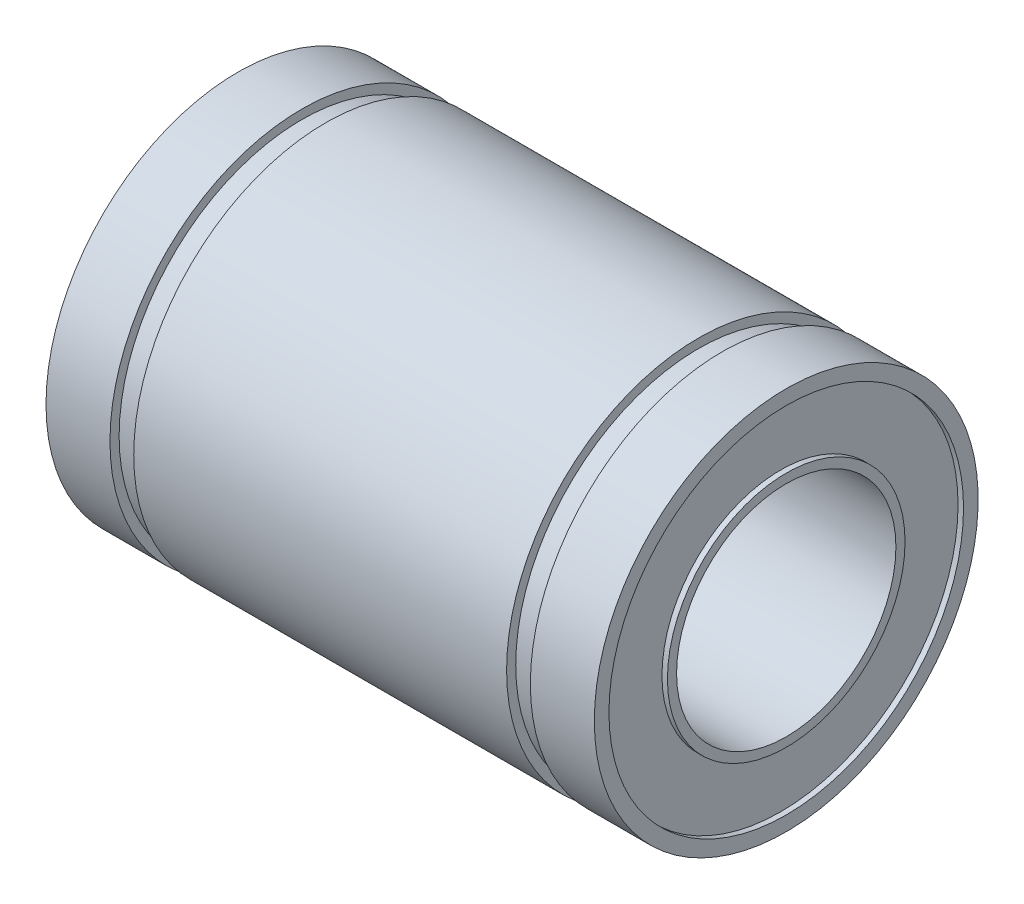
ISO-10303-21;
HEADER;
FILE_DESCRIPTION(('STEP AP214'),'2;1');
FILE_NAME('part.step','',(''),(''),'','','');
FILE_SCHEMA(('AUTOMOTIVE_DESIGN { 1 0 10303 214 1 1 1 1 }'));
ENDSEC;
DATA;
#1=APPLICATION_CONTEXT('core data for automotive mechanical design processes');
#2=APPLICATION_PROTOCOL_DEFINITION('international standard','automotive_design',2000,#1);
#3=PRODUCT_CONTEXT('',#1,'mechanical');
#4=PRODUCT('Part','Part','',(#3));
#5=PRODUCT_RELATED_PRODUCT_CATEGORY('part','',(#4));
#6=PRODUCT_DEFINITION_FORMATION('','',#4);
#7=PRODUCT_DEFINITION_CONTEXT('part definition',#1,'design');
#8=PRODUCT_DEFINITION('design','',#6,#7);
#9=PRODUCT_DEFINITION_SHAPE('','',#8);
#10=(LENGTH_UNIT() NAMED_UNIT(*) SI_UNIT(.MILLI.,.METRE.));
#11=(NAMED_UNIT(*) PLANE_ANGLE_UNIT() SI_UNIT($,.RADIAN.));
#12=(NAMED_UNIT(*) SI_UNIT($,.STERADIAN.) SOLID_ANGLE_UNIT());
#13=UNCERTAINTY_MEASURE_WITH_UNIT(LENGTH_MEASURE(1.E-05),#10,'distance_accuracy_value','');
#14=(GEOMETRIC_REPRESENTATION_CONTEXT(3) GLOBAL_UNCERTAINTY_ASSIGNED_CONTEXT((#13)) GLOBAL_UNIT_ASSIGNED_CONTEXT((#10,
#11,#12)) REPRESENTATION_CONTEXT('',''));
#15=CARTESIAN_POINT('',(0.,0.,0.));
#16=DIRECTION('',(0.,0.,1.));
#17=DIRECTION('',(1.,0.,0.));
#18=AXIS2_PLACEMENT_3D('',#15,#16,#17);
#19=CARTESIAN_POINT('',(-15.,6.,0.));
#20=DIRECTION('',(1.,0.,0.));
#21=DIRECTION('',(0.,0.,-1.));
#22=AXIS2_PLACEMENT_3D('',#19,#20,#21);
#23=PLANE('',#22);
#24=CARTESIAN_POINT('',(-15.,0.,0.));
#25=DIRECTION('',(-1.,0.,0.));
#26=DIRECTION('',(0.,0.,1.));
#27=AXIS2_PLACEMENT_3D('',#24,#25,#26);
#28=CIRCLE('',#27,6.);
#29=CARTESIAN_POINT('',(-15.,0.,6.));
#30=VERTEX_POINT('',#29);
#31=EDGE_CURVE('E97',#30,#30,#28,.T.);
#32=ORIENTED_EDGE('',*,*,#31,.F.);
#33=EDGE_LOOP('',(#32));
#34=FACE_BOUND('',#33,.T.);
#35=CARTESIAN_POINT('',(-15.,0.,0.));
#36=DIRECTION('',(-1.,0.,0.));
#37=DIRECTION('',(0.,0.,1.));
#38=AXIS2_PLACEMENT_3D('',#35,#36,#37);
#39=CIRCLE('',#38,6.5);
#40=CARTESIAN_POINT('',(-15.,0.,6.5));
#41=VERTEX_POINT('',#40);
#42=EDGE_CURVE('E10',#41,#41,#39,.T.);
#43=ORIENTED_EDGE('',*,*,#42,.T.);
#44=EDGE_LOOP('',(#43));
#45=FACE_BOUND('',#44,.T.);
#46=ADVANCED_FACE('F33',(#34,#45),#23,.F.);
#47=CARTESIAN_POINT('',(-15.,0.,0.));
#48=DIRECTION('',(-1.,0.,0.));
#49=DIRECTION('',(0.,0.,1.));
#50=AXIS2_PLACEMENT_3D('',#47,#48,#49);
#51=CYLINDRICAL_SURFACE('',#50,6.5);
#52=ORIENTED_EDGE('',*,*,#42,.F.);
#53=EDGE_LOOP('',(#52));
#54=FACE_BOUND('',#53,.T.);
#55=CARTESIAN_POINT('',(-14.7,0.,0.));
#56=DIRECTION('',(-1.,0.,0.));
#57=DIRECTION('',(0.,0.,1.));
#58=AXIS2_PLACEMENT_3D('',#55,#56,#57);
#59=CIRCLE('',#58,6.5);
#60=CARTESIAN_POINT('',(-14.7,0.,6.5));
#61=VERTEX_POINT('',#60);
#62=EDGE_CURVE('E39',#61,#61,#59,.T.);
#63=ORIENTED_EDGE('',*,*,#62,.T.);
#64=EDGE_LOOP('',(#63));
#65=FACE_BOUND('',#64,.T.);
#66=ADVANCED_FACE('F104',(#54,#65),#51,.T.);
#67=CARTESIAN_POINT('',(-14.7,9.7,0.));
#68=DIRECTION('',(1.,0.,0.));
#69=DIRECTION('',(0.,0.,-1.));
#70=AXIS2_PLACEMENT_3D('',#67,#68,#69);
#71=PLANE('',#70);
#72=ORIENTED_EDGE('',*,*,#62,.F.);
#73=EDGE_LOOP('',(#72));
#74=FACE_BOUND('',#73,.T.);
#75=CARTESIAN_POINT('',(-14.7,0.,0.));
#76=DIRECTION('',(-1.,0.,0.));
#77=DIRECTION('',(0.,0.,1.));
#78=AXIS2_PLACEMENT_3D('',#75,#76,#77);
#79=CIRCLE('',#78,9.7);
#80=CARTESIAN_POINT('',(-14.7,0.,9.7));
#81=VERTEX_POINT('',#80);
#82=EDGE_CURVE('E43',#81,#81,#79,.T.);
#83=ORIENTED_EDGE('',*,*,#82,.T.);
#84=EDGE_LOOP('',(#83));
#85=FACE_BOUND('',#84,.T.);
#86=ADVANCED_FACE('F108',(#74,#85),#71,.F.);
#87=CARTESIAN_POINT('',(-15.,0.,0.));
#88=DIRECTION('',(-1.,0.,0.));
#89=DIRECTION('',(0.,0.,1.));
#90=AXIS2_PLACEMENT_3D('',#87,#88,#89);
#91=CYLINDRICAL_SURFACE('',#90,9.7);
#92=ORIENTED_EDGE('',*,*,#82,.F.);
#93=EDGE_LOOP('',(#92));
#94=FACE_BOUND('',#93,.T.);
#95=CARTESIAN_POINT('',(-15.,0.,0.));
#96=DIRECTION('',(-1.,0.,0.));
#97=DIRECTION('',(0.,0.,1.));
#98=AXIS2_PLACEMENT_3D('',#95,#96,#97);
#99=CIRCLE('',#98,9.7);
#100=CARTESIAN_POINT('',(-15.,0.,9.7));
#101=VERTEX_POINT('',#100);
#102=EDGE_CURVE('E47',#101,#101,#99,.T.);
#103=ORIENTED_EDGE('',*,*,#102,.T.);
#104=EDGE_LOOP('',(#103));
#105=FACE_BOUND('',#104,.T.);
#106=ADVANCED_FACE('F113',(#94,#105),#91,.F.);
#107=CARTESIAN_POINT('',(-15.,9.7,0.));
#108=DIRECTION('',(1.,0.,0.));
#109=DIRECTION('',(0.,0.,-1.));
#110=AXIS2_PLACEMENT_3D('',#107,#108,#109);
#111=PLANE('',#110);
#112=ORIENTED_EDGE('',*,*,#102,.F.);
#113=EDGE_LOOP('',(#112));
#114=FACE_BOUND('',#113,.T.);
#115=CARTESIAN_POINT('',(-15.,0.,0.));
#116=DIRECTION('',(-1.,0.,0.));
#117=DIRECTION('',(0.,0.,1.));
#118=AXIS2_PLACEMENT_3D('',#115,#116,#117);
#119=CIRCLE('',#118,10.5);
#120=CARTESIAN_POINT('',(-15.,0.,10.5));
#121=VERTEX_POINT('',#120);
#122=EDGE_CURVE('E52',#121,#121,#119,.T.);
#123=ORIENTED_EDGE('',*,*,#122,.T.);
#124=EDGE_LOOP('',(#123));
#125=FACE_BOUND('',#124,.T.);
#126=ADVANCED_FACE('F119',(#114,#125),#111,.F.);
#127=CARTESIAN_POINT('',(-15.,0.,0.));
#128=DIRECTION('',(-1.,0.,0.));
#129=DIRECTION('',(0.,0.,1.));
#130=AXIS2_PLACEMENT_3D('',#127,#128,#129);
#131=CYLINDRICAL_SURFACE('',#130,10.5);
#132=ORIENTED_EDGE('',*,*,#122,.F.);
#133=EDGE_LOOP('',(#132));
#134=FACE_BOUND('',#133,.T.);
#135=CARTESIAN_POINT('',(-11.5,0.,0.));
#136=DIRECTION('',(-1.,0.,0.));
#137=DIRECTION('',(0.,0.,1.));
#138=AXIS2_PLACEMENT_3D('',#135,#136,#137);
#139=CIRCLE('',#138,10.5);
#140=CARTESIAN_POINT('',(-11.5,0.,10.5));
#141=VERTEX_POINT('',#140);
#142=EDGE_CURVE('E55',#141,#141,#139,.T.);
#143=ORIENTED_EDGE('',*,*,#142,.T.);
#144=EDGE_LOOP('',(#143));
#145=FACE_BOUND('',#144,.T.);
#146=ADVANCED_FACE('F123',(#134,#145),#131,.T.);
#147=CARTESIAN_POINT('',(-11.5,10.5,0.));
#148=DIRECTION('',(-1.,0.,0.));
#149=DIRECTION('',(0.,0.,1.));
#150=AXIS2_PLACEMENT_3D('',#147,#148,#149);
#151=PLANE('',#150);
#152=ORIENTED_EDGE('',*,*,#142,.F.);
#153=EDGE_LOOP('',(#152));
#154=FACE_BOUND('',#153,.T.);
#155=CARTESIAN_POINT('',(-11.5,0.,0.));
#156=DIRECTION('',(-1.,0.,0.));
#157=DIRECTION('',(0.,0.,1.));
#158=AXIS2_PLACEMENT_3D('',#155,#156,#157);
#159=CIRCLE('',#158,10.);
#160=CARTESIAN_POINT('',(-11.5,0.,10.));
#161=VERTEX_POINT('',#160);
#162=EDGE_CURVE('E58',#161,#161,#159,.T.);
#163=ORIENTED_EDGE('',*,*,#162,.T.);
#164=EDGE_LOOP('',(#163));
#165=FACE_BOUND('',#164,.T.);
#166=ADVANCED_FACE('F127',(#154,#165),#151,.F.);
#167=CARTESIAN_POINT('',(-15.,0.,0.));
#168=DIRECTION('',(-1.,0.,0.));
#169=DIRECTION('',(0.,0.,1.));
#170=AXIS2_PLACEMENT_3D('',#167,#168,#169);
#171=CYLINDRICAL_SURFACE('',#170,10.);
#172=ORIENTED_EDGE('',*,*,#162,.F.);
#173=EDGE_LOOP('',(#172));
#174=FACE_BOUND('',#173,.T.);
#175=CARTESIAN_POINT('',(-10.2,0.,0.));
#176=DIRECTION('',(-1.,0.,0.));
#177=DIRECTION('',(0.,0.,1.));
#178=AXIS2_PLACEMENT_3D('',#175,#176,#177);
#179=CIRCLE('',#178,10.);
#180=CARTESIAN_POINT('',(-10.2,0.,10.));
#181=VERTEX_POINT('',#180);
#182=EDGE_CURVE('E61',#181,#181,#179,.T.);
#183=ORIENTED_EDGE('',*,*,#182,.T.);
#184=EDGE_LOOP('',(#183));
#185=FACE_BOUND('',#184,.T.);
#186=ADVANCED_FACE('F131',(#174,#185),#171,.T.);
#187=CARTESIAN_POINT('',(-10.2,10.5,0.));
#188=DIRECTION('',(1.,0.,0.));
#189=DIRECTION('',(0.,0.,-1.));
#190=AXIS2_PLACEMENT_3D('',#187,#188,#189);
#191=PLANE('',#190);
#192=ORIENTED_EDGE('',*,*,#182,.F.);
#193=EDGE_LOOP('',(#192));
#194=FACE_BOUND('',#193,.T.);
#195=CARTESIAN_POINT('',(-10.2,0.,0.));
#196=DIRECTION('',(-1.,0.,0.));
#197=DIRECTION('',(0.,0.,1.));
#198=AXIS2_PLACEMENT_3D('',#195,#196,#197);
#199=CIRCLE('',#198,10.5);
#200=CARTESIAN_POINT('',(-10.2,0.,10.5));
#201=VERTEX_POINT('',#200);
#202=EDGE_CURVE('E64',#201,#201,#199,.T.);
#203=ORIENTED_EDGE('',*,*,#202,.T.);
#204=EDGE_LOOP('',(#203));
#205=FACE_BOUND('',#204,.T.);
#206=ADVANCED_FACE('F135',(#194,#205),#191,.F.);
#207=CARTESIAN_POINT('',(-15.,0.,0.));
#208=DIRECTION('',(-1.,0.,0.));
#209=DIRECTION('',(0.,0.,1.));
#210=AXIS2_PLACEMENT_3D('',#207,#208,#209);
#211=CYLINDRICAL_SURFACE('',#210,10.5);
#212=ORIENTED_EDGE('',*,*,#202,.F.);
#213=EDGE_LOOP('',(#212));
#214=FACE_BOUND('',#213,.T.);
#215=CARTESIAN_POINT('',(10.2,0.,0.));
#216=DIRECTION('',(-1.,0.,0.));
#217=DIRECTION('',(0.,0.,1.));
#218=AXIS2_PLACEMENT_3D('',#215,#216,#217);
#219=CIRCLE('',#218,10.5);
#220=CARTESIAN_POINT('',(10.2,0.,10.5));
#221=VERTEX_POINT('',#220);
#222=EDGE_CURVE('E67',#221,#221,#219,.T.);
#223=ORIENTED_EDGE('',*,*,#222,.T.);
#224=EDGE_LOOP('',(#223));
#225=FACE_BOUND('',#224,.T.);
#226=ADVANCED_FACE('F139',(#214,#225),#211,.T.);
#227=CARTESIAN_POINT('',(10.2,10.5,0.));
#228=DIRECTION('',(-1.,0.,0.));
#229=DIRECTION('',(0.,0.,1.));
#230=AXIS2_PLACEMENT_3D('',#227,#228,#229);
#231=PLANE('',#230);
#232=ORIENTED_EDGE('',*,*,#222,.F.);
#233=EDGE_LOOP('',(#232));
#234=FACE_BOUND('',#233,.T.);
#235=CARTESIAN_POINT('',(10.2,0.,0.));
#236=DIRECTION('',(-1.,0.,0.));
#237=DIRECTION('',(0.,0.,1.));
#238=AXIS2_PLACEMENT_3D('',#235,#236,#237);
#239=CIRCLE('',#238,10.);
#240=CARTESIAN_POINT('',(10.2,0.,10.));
#241=VERTEX_POINT('',#240);
#242=EDGE_CURVE('E70',#241,#241,#239,.T.);
#243=ORIENTED_EDGE('',*,*,#242,.T.);
#244=EDGE_LOOP('',(#243));
#245=FACE_BOUND('',#244,.T.);
#246=ADVANCED_FACE('F143',(#234,#245),#231,.F.);
#247=CARTESIAN_POINT('',(-15.,0.,0.));
#248=DIRECTION('',(-1.,0.,0.));
#249=DIRECTION('',(0.,0.,1.));
#250=AXIS2_PLACEMENT_3D('',#247,#248,#249);
#251=CYLINDRICAL_SURFACE('',#250,10.);
#252=ORIENTED_EDGE('',*,*,#242,.F.);
#253=EDGE_LOOP('',(#252));
#254=FACE_BOUND('',#253,.T.);
#255=CARTESIAN_POINT('',(11.5,0.,0.));
#256=DIRECTION('',(-1.,0.,0.));
#257=DIRECTION('',(0.,0.,1.));
#258=AXIS2_PLACEMENT_3D('',#255,#256,#257);
#259=CIRCLE('',#258,10.);
#260=CARTESIAN_POINT('',(11.5,0.,10.));
#261=VERTEX_POINT('',#260);
#262=EDGE_CURVE('E73',#261,#261,#259,.T.);
#263=ORIENTED_EDGE('',*,*,#262,.T.);
#264=EDGE_LOOP('',(#263));
#265=FACE_BOUND('',#264,.T.);
#266=ADVANCED_FACE('F147',(#254,#265),#251,.T.);
#267=CARTESIAN_POINT('',(11.5,10.5,0.));
#268=DIRECTION('',(1.,0.,0.));
#269=DIRECTION('',(0.,0.,-1.));
#270=AXIS2_PLACEMENT_3D('',#267,#268,#269);
#271=PLANE('',#270);
#272=ORIENTED_EDGE('',*,*,#262,.F.);
#273=EDGE_LOOP('',(#272));
#274=FACE_BOUND('',#273,.T.);
#275=CARTESIAN_POINT('',(11.5,0.,0.));
#276=DIRECTION('',(-1.,0.,0.));
#277=DIRECTION('',(0.,0.,1.));
#278=AXIS2_PLACEMENT_3D('',#275,#276,#277);
#279=CIRCLE('',#278,10.5);
#280=CARTESIAN_POINT('',(11.5,0.,10.5));
#281=VERTEX_POINT('',#280);
#282=EDGE_CURVE('E76',#281,#281,#279,.T.);
#283=ORIENTED_EDGE('',*,*,#282,.T.);
#284=EDGE_LOOP('',(#283));
#285=FACE_BOUND('',#284,.T.);
#286=ADVANCED_FACE('F151',(#274,#285),#271,.F.);
#287=CARTESIAN_POINT('',(-15.,0.,0.));
#288=DIRECTION('',(-1.,0.,0.));
#289=DIRECTION('',(0.,0.,1.));
#290=AXIS2_PLACEMENT_3D('',#287,#288,#289);
#291=CYLINDRICAL_SURFACE('',#290,10.5);
#292=ORIENTED_EDGE('',*,*,#282,.F.);
#293=EDGE_LOOP('',(#292));
#294=FACE_BOUND('',#293,.T.);
#295=CARTESIAN_POINT('',(15.,0.,0.));
#296=DIRECTION('',(-1.,0.,0.));
#297=DIRECTION('',(0.,0.,1.));
#298=AXIS2_PLACEMENT_3D('',#295,#296,#297);
#299=CIRCLE('',#298,10.5);
#300=CARTESIAN_POINT('',(15.,0.,10.5));
#301=VERTEX_POINT('',#300);
#302=EDGE_CURVE('E79',#301,#301,#299,.T.);
#303=ORIENTED_EDGE('',*,*,#302,.T.);
#304=EDGE_LOOP('',(#303));
#305=FACE_BOUND('',#304,.T.);
#306=ADVANCED_FACE('F155',(#294,#305),#291,.T.);
#307=CARTESIAN_POINT('',(15.,9.7,0.));
#308=DIRECTION('',(-1.,0.,0.));
#309=DIRECTION('',(0.,0.,1.));
#310=AXIS2_PLACEMENT_3D('',#307,#308,#309);
#311=PLANE('',#310);
#312=ORIENTED_EDGE('',*,*,#302,.F.);
#313=EDGE_LOOP('',(#312));
#314=FACE_BOUND('',#313,.T.);
#315=CARTESIAN_POINT('',(15.,0.,0.));
#316=DIRECTION('',(-1.,0.,0.));
#317=DIRECTION('',(0.,0.,1.));
#318=AXIS2_PLACEMENT_3D('',#315,#316,#317);
#319=CIRCLE('',#318,9.7);
#320=CARTESIAN_POINT('',(15.,0.,9.7));
#321=VERTEX_POINT('',#320);
#322=EDGE_CURVE('E82',#321,#321,#319,.T.);
#323=ORIENTED_EDGE('',*,*,#322,.T.);
#324=EDGE_LOOP('',(#323));
#325=FACE_BOUND('',#324,.T.);
#326=ADVANCED_FACE('F159',(#314,#325),#311,.F.);
#327=CARTESIAN_POINT('',(-15.,0.,0.));
#328=DIRECTION('',(-1.,0.,0.));
#329=DIRECTION('',(0.,0.,1.));
#330=AXIS2_PLACEMENT_3D('',#327,#328,#329);
#331=CYLINDRICAL_SURFACE('',#330,9.7);
#332=ORIENTED_EDGE('',*,*,#322,.F.);
#333=EDGE_LOOP('',(#332));
#334=FACE_BOUND('',#333,.T.);
#335=CARTESIAN_POINT('',(14.7,0.,0.));
#336=DIRECTION('',(-1.,0.,0.));
#337=DIRECTION('',(0.,0.,1.));
#338=AXIS2_PLACEMENT_3D('',#335,#336,#337);
#339=CIRCLE('',#338,9.7);
#340=CARTESIAN_POINT('',(14.7,0.,9.7));
#341=VERTEX_POINT('',#340);
#342=EDGE_CURVE('E85',#341,#341,#339,.T.);
#343=ORIENTED_EDGE('',*,*,#342,.T.);
#344=EDGE_LOOP('',(#343));
#345=FACE_BOUND('',#344,.T.);
#346=ADVANCED_FACE('F163',(#334,#345),#331,.F.);
#347=CARTESIAN_POINT('',(14.7,9.7,0.));
#348=DIRECTION('',(-1.,0.,0.));
#349=DIRECTION('',(0.,0.,1.));
#350=AXIS2_PLACEMENT_3D('',#347,#348,#349);
#351=PLANE('',#350);
#352=ORIENTED_EDGE('',*,*,#342,.F.);
#353=EDGE_LOOP('',(#352));
#354=FACE_BOUND('',#353,.T.);
#355=CARTESIAN_POINT('',(14.7,0.,0.));
#356=DIRECTION('',(-1.,0.,0.));
#357=DIRECTION('',(0.,0.,1.));
#358=AXIS2_PLACEMENT_3D('',#355,#356,#357);
#359=CIRCLE('',#358,6.5);
#360=CARTESIAN_POINT('',(14.7,0.,6.5));
#361=VERTEX_POINT('',#360);
#362=EDGE_CURVE('E88',#361,#361,#359,.T.);
#363=ORIENTED_EDGE('',*,*,#362,.T.);
#364=EDGE_LOOP('',(#363));
#365=FACE_BOUND('',#364,.T.);
#366=ADVANCED_FACE('F167',(#354,#365),#351,.F.);
#367=CARTESIAN_POINT('',(-15.,0.,0.));
#368=DIRECTION('',(-1.,0.,0.));
#369=DIRECTION('',(0.,0.,1.));
#370=AXIS2_PLACEMENT_3D('',#367,#368,#369);
#371=CYLINDRICAL_SURFACE('',#370,6.5);
#372=ORIENTED_EDGE('',*,*,#362,.F.);
#373=EDGE_LOOP('',(#372));
#374=FACE_BOUND('',#373,.T.);
#375=CARTESIAN_POINT('',(15.,0.,0.));
#376=DIRECTION('',(-1.,0.,0.));
#377=DIRECTION('',(0.,0.,1.));
#378=AXIS2_PLACEMENT_3D('',#375,#376,#377);
#379=CIRCLE('',#378,6.5);
#380=CARTESIAN_POINT('',(15.,0.,6.5));
#381=VERTEX_POINT('',#380);
#382=EDGE_CURVE('E91',#381,#381,#379,.T.);
#383=ORIENTED_EDGE('',*,*,#382,.T.);
#384=EDGE_LOOP('',(#383));
#385=FACE_BOUND('',#384,.T.);
#386=ADVANCED_FACE('F171',(#374,#385),#371,.T.);
#387=CARTESIAN_POINT('',(15.,6.,0.));
#388=DIRECTION('',(-1.,0.,0.));
#389=DIRECTION('',(0.,0.,1.));
#390=AXIS2_PLACEMENT_3D('',#387,#388,#389);
#391=PLANE('',#390);
#392=ORIENTED_EDGE('',*,*,#382,.F.);
#393=EDGE_LOOP('',(#392));
#394=FACE_BOUND('',#393,.T.);
#395=CARTESIAN_POINT('',(15.,0.,0.));
#396=DIRECTION('',(-1.,0.,0.));
#397=DIRECTION('',(0.,0.,1.));
#398=AXIS2_PLACEMENT_3D('',#395,#396,#397);
#399=CIRCLE('',#398,6.);
#400=CARTESIAN_POINT('',(15.,0.,6.));
#401=VERTEX_POINT('',#400);
#402=EDGE_CURVE('E94',#401,#401,#399,.T.);
#403=ORIENTED_EDGE('',*,*,#402,.T.);
#404=EDGE_LOOP('',(#403));
#405=FACE_BOUND('',#404,.T.);
#406=ADVANCED_FACE('F175',(#394,#405),#391,.F.);
#407=CARTESIAN_POINT('',(-15.,0.,0.));
#408=DIRECTION('',(-1.,0.,0.));
#409=DIRECTION('',(0.,0.,1.));
#410=AXIS2_PLACEMENT_3D('',#407,#408,#409);
#411=CYLINDRICAL_SURFACE('',#410,6.);
#412=ORIENTED_EDGE('',*,*,#402,.F.);
#413=EDGE_LOOP('',(#412));
#414=FACE_BOUND('',#413,.T.);
#415=ORIENTED_EDGE('',*,*,#31,.T.);
#416=EDGE_LOOP('',(#415));
#417=FACE_BOUND('',#416,.T.);
#418=ADVANCED_FACE('F101',(#414,#417),#411,.F.);
#419=CLOSED_SHELL('',(#46,#66,#86,#106,#126,#146,#166,#186,#206,#226,#246,#266,#286,#306,#326,
#346,#366,#386,#406,#418));
#420=MANIFOLD_SOLID_BREP('B2',#419);
#421=ADVANCED_BREP_SHAPE_REPRESENTATION('',(#18,#420),#14);
#422=SHAPE_DEFINITION_REPRESENTATION(#9,#421);
ENDSEC;
END-ISO-10303-21;
